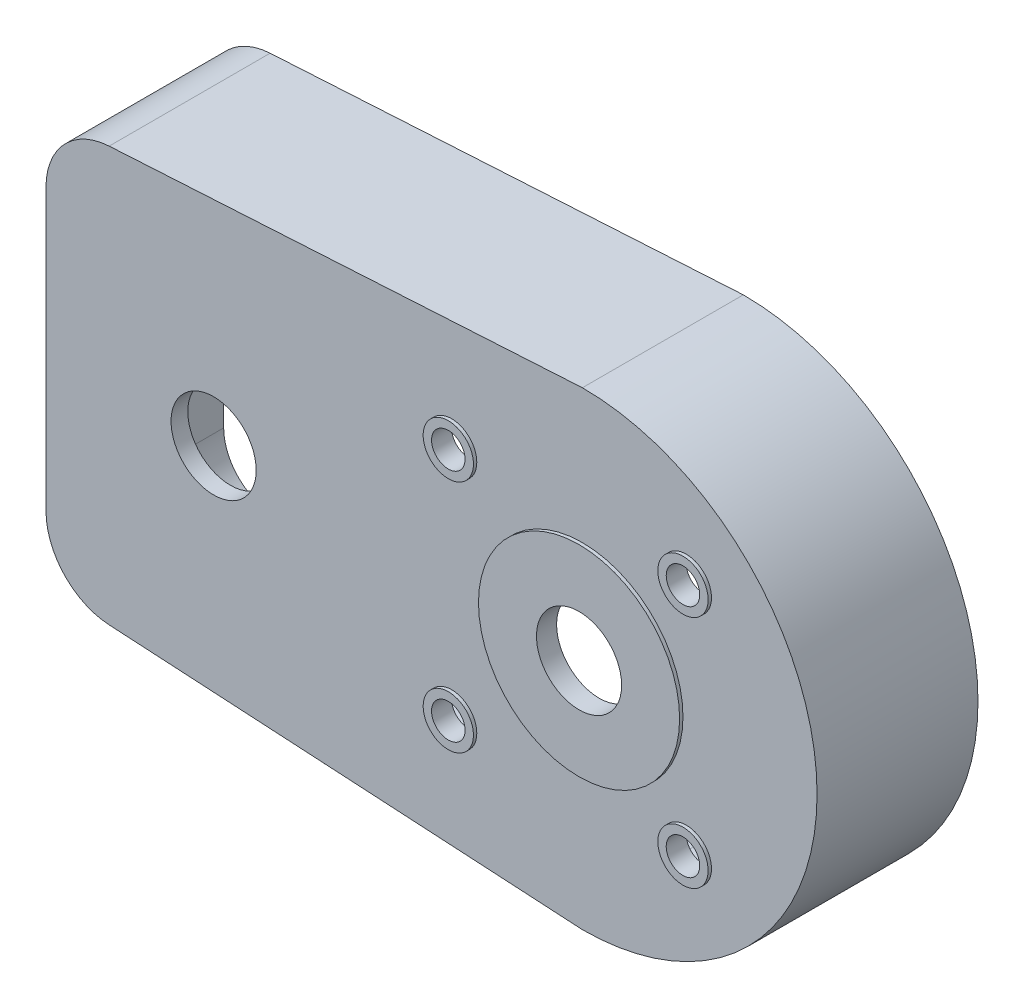
ISO-10303-21;
HEADER;
FILE_DESCRIPTION(('STEP AP214'),'2;1');
FILE_NAME('part.step','',(''),(''),'','','');
FILE_SCHEMA(('AUTOMOTIVE_DESIGN { 1 0 10303 214 1 1 1 1 }'));
ENDSEC;
DATA;
#1=APPLICATION_CONTEXT('core data for automotive mechanical design processes');
#2=APPLICATION_PROTOCOL_DEFINITION('international standard','automotive_design',2000,#1);
#3=PRODUCT_CONTEXT('',#1,'mechanical');
#4=PRODUCT('Part','Part','',(#3));
#5=PRODUCT_RELATED_PRODUCT_CATEGORY('part','',(#4));
#6=PRODUCT_DEFINITION_FORMATION('','',#4);
#7=PRODUCT_DEFINITION_CONTEXT('part definition',#1,'design');
#8=PRODUCT_DEFINITION('design','',#6,#7);
#9=PRODUCT_DEFINITION_SHAPE('','',#8);
#10=(LENGTH_UNIT() NAMED_UNIT(*) SI_UNIT(.MILLI.,.METRE.));
#11=(NAMED_UNIT(*) PLANE_ANGLE_UNIT() SI_UNIT($,.RADIAN.));
#12=(NAMED_UNIT(*) SI_UNIT($,.STERADIAN.) SOLID_ANGLE_UNIT());
#13=UNCERTAINTY_MEASURE_WITH_UNIT(LENGTH_MEASURE(1.E-05),#10,'distance_accuracy_value','');
#14=(GEOMETRIC_REPRESENTATION_CONTEXT(3) GLOBAL_UNCERTAINTY_ASSIGNED_CONTEXT((#13)) GLOBAL_UNIT_ASSIGNED_CONTEXT((#10,
#11,#12)) REPRESENTATION_CONTEXT('',''));
#15=CARTESIAN_POINT('',(0.,0.,0.));
#16=DIRECTION('',(0.,0.,1.));
#17=DIRECTION('',(1.,0.,0.));
#18=AXIS2_PLACEMENT_3D('',#15,#16,#17);
#19=CARTESIAN_POINT('',(160.,0.,-19.));
#20=DIRECTION('',(0.,0.,1.));
#21=DIRECTION('',(1.,0.,0.));
#22=AXIS2_PLACEMENT_3D('',#19,#20,#21);
#23=CYLINDRICAL_SURFACE('',#22,12.7);
#24=CARTESIAN_POINT('',(160.,0.,19.));
#25=DIRECTION('',(0.,0.,-1.));
#26=DIRECTION('',(-1.,0.,0.));
#27=AXIS2_PLACEMENT_3D('',#24,#25,#26);
#28=CIRCLE('',#27,12.7);
#29=CARTESIAN_POINT('',(147.3,0.,19.));
#30=VERTEX_POINT('',#29);
#31=EDGE_CURVE('E162',#30,#30,#28,.T.);
#32=ORIENTED_EDGE('',*,*,#31,.T.);
#33=EDGE_LOOP('',(#32));
#34=FACE_BOUND('',#33,.T.);
#35=CARTESIAN_POINT('',(160.,0.,25.));
#36=DIRECTION('',(0.,0.,1.));
#37=DIRECTION('',(1.,0.,0.));
#38=AXIS2_PLACEMENT_3D('',#35,#36,#37);
#39=CIRCLE('',#38,12.7);
#40=CARTESIAN_POINT('',(172.7,0.,25.));
#41=VERTEX_POINT('',#40);
#42=EDGE_CURVE('E45',#41,#41,#39,.T.);
#43=ORIENTED_EDGE('',*,*,#42,.T.);
#44=EDGE_LOOP('',(#43));
#45=FACE_BOUND('',#44,.T.);
#46=ADVANCED_FACE('F41',(#34,#45),#23,.F.);
#47=CARTESIAN_POINT('',(20.,41.8728550290396,24.));
#48=DIRECTION('',(0.,0.,1.));
#49=DIRECTION('',(1.,0.,0.));
#50=AXIS2_PLACEMENT_3D('',#47,#48,#49);
#51=PLANE('',#50);
#52=CARTESIAN_POINT('',(50.,0.,24.));
#53=DIRECTION('',(0.,0.,1.));
#54=DIRECTION('',(1.,0.,0.));
#55=AXIS2_PLACEMENT_3D('',#52,#53,#54);
#56=CIRCLE('',#55,12.7);
#57=CARTESIAN_POINT('',(62.7,0.,24.));
#58=VERTEX_POINT('',#57);
#59=EDGE_CURVE('E202',#58,#58,#56,.T.);
#60=ORIENTED_EDGE('',*,*,#59,.F.);
#61=EDGE_LOOP('',(#60));
#62=FACE_BOUND('',#61,.T.);
#63=CARTESIAN_POINT('',(160.,0.,24.));
#64=DIRECTION('',(0.,0.,1.));
#65=DIRECTION('',(1.,0.,0.));
#66=AXIS2_PLACEMENT_3D('',#63,#64,#65);
#67=CIRCLE('',#66,30.);
#68=CARTESIAN_POINT('',(190.,0.,24.));
#69=VERTEX_POINT('',#68);
#70=EDGE_CURVE('E196',#69,#69,#67,.F.);
#71=ORIENTED_EDGE('',*,*,#70,.T.);
#72=EDGE_LOOP('',(#71));
#73=FACE_BOUND('',#72,.T.);
#74=CARTESIAN_POINT('',(191.,35.,24.));
#75=DIRECTION('',(0.,0.,1.));
#76=DIRECTION('',(1.,0.,0.));
#77=AXIS2_PLACEMENT_3D('',#74,#75,#76);
#78=CIRCLE('',#77,7.50000000000001);
#79=CARTESIAN_POINT('',(198.5,35.,24.));
#80=VERTEX_POINT('',#79);
#81=EDGE_CURVE('E186',#80,#80,#78,.F.);
#82=ORIENTED_EDGE('',*,*,#81,.T.);
#83=EDGE_LOOP('',(#82));
#84=FACE_BOUND('',#83,.T.);
#85=CARTESIAN_POINT('',(121.,35.,24.));
#86=DIRECTION('',(0.,0.,1.));
#87=DIRECTION('',(1.,0.,0.));
#88=AXIS2_PLACEMENT_3D('',#85,#86,#87);
#89=CIRCLE('',#88,7.50000000000001);
#90=CARTESIAN_POINT('',(128.5,35.,24.));
#91=VERTEX_POINT('',#90);
#92=EDGE_CURVE('E170',#91,#91,#89,.F.);
#93=ORIENTED_EDGE('',*,*,#92,.T.);
#94=EDGE_LOOP('',(#93));
#95=FACE_BOUND('',#94,.T.);
#96=CARTESIAN_POINT('',(20.,41.8728550290396,24.));
#97=DIRECTION('',(0.,0.,1.));
#98=DIRECTION('',(1.,0.,0.));
#99=AXIS2_PLACEMENT_3D('',#96,#97,#98);
#100=CIRCLE('',#99,20.);
#101=CARTESIAN_POINT('',(18.8456774284378,61.8395157263316,24.));
#102=VERTEX_POINT('',#101);
#103=CARTESIAN_POINT('',(0.,41.8728550290396,24.));
#104=VERTEX_POINT('',#103);
#105=EDGE_CURVE('E157',#102,#104,#100,.T.);
#106=ORIENTED_EDGE('',*,*,#105,.T.);
#107=DIRECTION('',(0.,-1.,0.));
#108=VECTOR('',#107,1.);
#109=CARTESIAN_POINT('',(0.,41.8728550290396,24.));
#110=LINE('',#109,#108);
#111=CARTESIAN_POINT('',(0.,-41.8728550290396,24.));
#112=VERTEX_POINT('',#111);
#113=EDGE_CURVE('E100',#104,#112,#110,.T.);
#114=ORIENTED_EDGE('',*,*,#113,.T.);
#115=CARTESIAN_POINT('',(20.,-41.8728550290396,24.));
#116=DIRECTION('',(0.,0.,-1.));
#117=DIRECTION('',(-1.,0.,0.));
#118=AXIS2_PLACEMENT_3D('',#115,#116,#117);
#119=CIRCLE('',#118,20.);
#120=CARTESIAN_POINT('',(18.8456774284378,-61.8395157263316,24.));
#121=VERTEX_POINT('',#120);
#122=EDGE_CURVE('E122',#121,#112,#119,.T.);
#123=ORIENTED_EDGE('',*,*,#122,.F.);
#124=DIRECTION('',(0.998333034864596,-0.0577161285781096,0.));
#125=VECTOR('',#124,1.);
#126=CARTESIAN_POINT('',(18.8456774284378,-61.8395157263316,24.));
#127=LINE('',#126,#125);
#128=CARTESIAN_POINT('',(160.,-70.,24.));
#129=VERTEX_POINT('',#128);
#130=EDGE_CURVE('E113',#121,#129,#127,.T.);
#131=ORIENTED_EDGE('',*,*,#130,.T.);
#132=CARTESIAN_POINT('',(160.,0.,24.));
#133=DIRECTION('',(0.,0.,1.));
#134=DIRECTION('',(1.,0.,0.));
#135=AXIS2_PLACEMENT_3D('',#132,#133,#134);
#136=CIRCLE('',#135,70.);
#137=CARTESIAN_POINT('',(160.,70.,24.));
#138=VERTEX_POINT('',#137);
#139=EDGE_CURVE('E119',#129,#138,#136,.T.);
#140=ORIENTED_EDGE('',*,*,#139,.T.);
#141=DIRECTION('',(0.998333034864596,0.0577161285781096,0.));
#142=VECTOR('',#141,1.);
#143=CARTESIAN_POINT('',(18.8456774284378,61.8395157263316,24.));
#144=LINE('',#143,#142);
#145=EDGE_CURVE('E137',#102,#138,#144,.T.);
#146=ORIENTED_EDGE('',*,*,#145,.F.);
#147=EDGE_LOOP('',(#106,#114,#123,#131,#140,#146));
#148=FACE_BOUND('',#147,.T.);
#149=CARTESIAN_POINT('',(121.,-35.,24.));
#150=DIRECTION('',(0.,0.,1.));
#151=DIRECTION('',(1.,0.,0.));
#152=AXIS2_PLACEMENT_3D('',#149,#150,#151);
#153=CIRCLE('',#152,7.50000000000001);
#154=CARTESIAN_POINT('',(128.5,-35.,24.));
#155=VERTEX_POINT('',#154);
#156=EDGE_CURVE('E181',#155,#155,#153,.F.);
#157=ORIENTED_EDGE('',*,*,#156,.T.);
#158=EDGE_LOOP('',(#157));
#159=FACE_BOUND('',#158,.T.);
#160=CARTESIAN_POINT('',(191.,-35.,24.));
#161=DIRECTION('',(0.,0.,1.));
#162=DIRECTION('',(1.,0.,0.));
#163=AXIS2_PLACEMENT_3D('',#160,#161,#162);
#164=CIRCLE('',#163,7.50000000000001);
#165=CARTESIAN_POINT('',(198.5,-35.,24.));
#166=VERTEX_POINT('',#165);
#167=EDGE_CURVE('E191',#166,#166,#164,.F.);
#168=ORIENTED_EDGE('',*,*,#167,.T.);
#169=EDGE_LOOP('',(#168));
#170=FACE_BOUND('',#169,.T.);
#171=ADVANCED_FACE('F115',(#62,#73,#84,#95,#148,#159,#170),#51,.T.);
#172=CARTESIAN_POINT('',(20.,41.8728550290396,19.));
#173=DIRECTION('',(0.,0.,-1.));
#174=DIRECTION('',(-1.,0.,0.));
#175=AXIS2_PLACEMENT_3D('',#172,#173,#174);
#176=PLANE('',#175);
#177=CARTESIAN_POINT('',(50.,0.,19.));
#178=DIRECTION('',(0.,0.,-1.));
#179=DIRECTION('',(-1.,0.,0.));
#180=AXIS2_PLACEMENT_3D('',#177,#178,#179);
#181=CIRCLE('',#180,12.7);
#182=CARTESIAN_POINT('',(37.3,0.,19.));
#183=VERTEX_POINT('',#182);
#184=EDGE_CURVE('E200',#183,#183,#181,.T.);
#185=ORIENTED_EDGE('',*,*,#184,.F.);
#186=EDGE_LOOP('',(#185));
#187=FACE_BOUND('',#186,.T.);
#188=CARTESIAN_POINT('',(121.,-35.,19.));
#189=DIRECTION('',(0.,0.,-1.));
#190=DIRECTION('',(-1.,0.,0.));
#191=AXIS2_PLACEMENT_3D('',#188,#189,#190);
#192=CIRCLE('',#191,4.99999999999999);
#193=CARTESIAN_POINT('',(116.,-35.,19.));
#194=VERTEX_POINT('',#193);
#195=EDGE_CURVE('E165',#194,#194,#192,.F.);
#196=ORIENTED_EDGE('',*,*,#195,.T.);
#197=EDGE_LOOP('',(#196));
#198=FACE_BOUND('',#197,.T.);
#199=CARTESIAN_POINT('',(191.,-35.,19.));
#200=DIRECTION('',(0.,0.,-1.));
#201=DIRECTION('',(-1.,0.,0.));
#202=AXIS2_PLACEMENT_3D('',#199,#200,#201);
#203=CIRCLE('',#202,5.00000000000002);
#204=CARTESIAN_POINT('',(186.,-35.,19.));
#205=VERTEX_POINT('',#204);
#206=EDGE_CURVE('E166',#205,#205,#203,.F.);
#207=ORIENTED_EDGE('',*,*,#206,.T.);
#208=EDGE_LOOP('',(#207));
#209=FACE_BOUND('',#208,.T.);
#210=ORIENTED_EDGE('',*,*,#31,.F.);
#211=EDGE_LOOP('',(#210));
#212=FACE_BOUND('',#211,.T.);
#213=CARTESIAN_POINT('',(20.,41.8728550290396,19.));
#214=DIRECTION('',(0.,0.,-1.));
#215=DIRECTION('',(-1.,0.,0.));
#216=AXIS2_PLACEMENT_3D('',#213,#214,#215);
#217=CIRCLE('',#216,15.);
#218=CARTESIAN_POINT('',(5.,41.8728550290396,19.));
#219=VERTEX_POINT('',#218);
#220=CARTESIAN_POINT('',(19.1342580713284,56.8478505520086,19.));
#221=VERTEX_POINT('',#220);
#222=EDGE_CURVE('E229',#219,#221,#217,.T.);
#223=ORIENTED_EDGE('',*,*,#222,.T.);
#224=DIRECTION('',(0.998333034864596,0.0577161285781096,0.));
#225=VECTOR('',#224,1.);
#226=CARTESIAN_POINT('',(19.1342580713284,56.8478505520086,19.));
#227=LINE('',#226,#225);
#228=CARTESIAN_POINT('',(160.141737642964,64.9998454647438,19.));
#229=VERTEX_POINT('',#228);
#230=EDGE_CURVE('E232',#221,#229,#227,.T.);
#231=ORIENTED_EDGE('',*,*,#230,.T.);
#232=CARTESIAN_POINT('',(160.,0.,19.));
#233=DIRECTION('',(0.,0.,-1.));
#234=DIRECTION('',(-1.,0.,0.));
#235=AXIS2_PLACEMENT_3D('',#232,#233,#234);
#236=CIRCLE('',#235,65.);
#237=CARTESIAN_POINT('',(160.141737642964,-64.9998454647438,19.));
#238=VERTEX_POINT('',#237);
#239=EDGE_CURVE('E236',#229,#238,#236,.T.);
#240=ORIENTED_EDGE('',*,*,#239,.T.);
#241=DIRECTION('',(-0.998333034864596,0.0577161285781096,0.));
#242=VECTOR('',#241,1.);
#243=CARTESIAN_POINT('',(160.141737642964,-64.9998454647438,19.));
#244=LINE('',#243,#242);
#245=CARTESIAN_POINT('',(19.1342580713284,-56.8478505520086,19.));
#246=VERTEX_POINT('',#245);
#247=EDGE_CURVE('E239',#238,#246,#244,.T.);
#248=ORIENTED_EDGE('',*,*,#247,.T.);
#249=CARTESIAN_POINT('',(20.,-41.8728550290396,19.));
#250=DIRECTION('',(0.,0.,-1.));
#251=DIRECTION('',(-1.,0.,0.));
#252=AXIS2_PLACEMENT_3D('',#249,#250,#251);
#253=CIRCLE('',#252,15.);
#254=CARTESIAN_POINT('',(5.00000000000001,-41.8728550290396,19.));
#255=VERTEX_POINT('',#254);
#256=EDGE_CURVE('E242',#246,#255,#253,.T.);
#257=ORIENTED_EDGE('',*,*,#256,.T.);
#258=DIRECTION('',(0.,1.,0.));
#259=VECTOR('',#258,1.);
#260=CARTESIAN_POINT('',(5.00000000000001,-41.8728550290396,19.));
#261=LINE('',#260,#259);
#262=EDGE_CURVE('E245',#255,#219,#261,.T.);
#263=ORIENTED_EDGE('',*,*,#262,.T.);
#264=EDGE_LOOP('',(#223,#231,#240,#248,#257,#263));
#265=FACE_BOUND('',#264,.T.);
#266=CARTESIAN_POINT('',(191.,35.,19.));
#267=DIRECTION('',(0.,0.,-1.));
#268=DIRECTION('',(-1.,0.,0.));
#269=AXIS2_PLACEMENT_3D('',#266,#267,#268);
#270=CIRCLE('',#269,4.99999999999999);
#271=CARTESIAN_POINT('',(186.,35.,19.));
#272=VERTEX_POINT('',#271);
#273=EDGE_CURVE('E169',#272,#272,#270,.T.);
#274=ORIENTED_EDGE('',*,*,#273,.F.);
#275=EDGE_LOOP('',(#274));
#276=FACE_BOUND('',#275,.T.);
#277=CARTESIAN_POINT('',(121.,35.,19.));
#278=DIRECTION('',(0.,0.,-1.));
#279=DIRECTION('',(-1.,0.,0.));
#280=AXIS2_PLACEMENT_3D('',#277,#278,#279);
#281=CIRCLE('',#280,4.99999999999999);
#282=CARTESIAN_POINT('',(116.,35.,19.));
#283=VERTEX_POINT('',#282);
#284=EDGE_CURVE('E173',#283,#283,#281,.T.);
#285=ORIENTED_EDGE('',*,*,#284,.F.);
#286=EDGE_LOOP('',(#285));
#287=FACE_BOUND('',#286,.T.);
#288=ADVANCED_FACE('F293',(#187,#198,#209,#212,#265,#276,#287),#176,.T.);
#289=CARTESIAN_POINT('',(20.,41.8728550290396,24.));
#290=DIRECTION('',(0.,0.,-1.));
#291=DIRECTION('',(-1.,0.,0.));
#292=AXIS2_PLACEMENT_3D('',#289,#290,#291);
#293=CYLINDRICAL_SURFACE('',#292,20.);
#294=CARTESIAN_POINT('',(20.,41.8728550290396,-24.));
#295=DIRECTION('',(0.,0.,1.));
#296=DIRECTION('',(1.,0.,0.));
#297=AXIS2_PLACEMENT_3D('',#294,#295,#296);
#298=CIRCLE('',#297,20.);
#299=CARTESIAN_POINT('',(18.8456774284378,61.8395157263316,-24.));
#300=VERTEX_POINT('',#299);
#301=CARTESIAN_POINT('',(0.,41.8728550290396,-24.));
#302=VERTEX_POINT('',#301);
#303=EDGE_CURVE('E142',#300,#302,#298,.T.);
#304=ORIENTED_EDGE('',*,*,#303,.T.);
#305=DIRECTION('',(0.,0.,-1.));
#306=VECTOR('',#305,1.);
#307=CARTESIAN_POINT('',(0.,41.8728550290396,24.));
#308=LINE('',#307,#306);
#309=EDGE_CURVE('E11',#104,#302,#308,.T.);
#310=ORIENTED_EDGE('',*,*,#309,.F.);
#311=ORIENTED_EDGE('',*,*,#105,.F.);
#312=DIRECTION('',(0.,0.,-1.));
#313=VECTOR('',#312,1.);
#314=CARTESIAN_POINT('',(18.8456774284378,61.8395157263316,24.));
#315=LINE('',#314,#313);
#316=EDGE_CURVE('E67',#102,#300,#315,.T.);
#317=ORIENTED_EDGE('',*,*,#316,.T.);
#318=EDGE_LOOP('',(#304,#310,#311,#317));
#319=FACE_BOUND('',#318,.T.);
#320=ADVANCED_FACE('F43',(#319),#293,.T.);
#321=CARTESIAN_POINT('',(0.,41.8728550290396,24.));
#322=DIRECTION('',(1.,0.,0.));
#323=DIRECTION('',(0.,1.,0.));
#324=AXIS2_PLACEMENT_3D('',#321,#322,#323);
#325=PLANE('',#324);
#326=DIRECTION('',(0.,-1.,0.));
#327=VECTOR('',#326,1.);
#328=CARTESIAN_POINT('',(0.,41.8728550290396,-24.));
#329=LINE('',#328,#327);
#330=CARTESIAN_POINT('',(0.,-41.8728550290396,-24.));
#331=VERTEX_POINT('',#330);
#332=EDGE_CURVE('E144',#302,#331,#329,.T.);
#333=ORIENTED_EDGE('',*,*,#332,.T.);
#334=DIRECTION('',(0.,0.,-1.));
#335=VECTOR('',#334,1.);
#336=CARTESIAN_POINT('',(0.,-41.8728550290396,24.));
#337=LINE('',#336,#335);
#338=EDGE_CURVE('E50',#112,#331,#337,.T.);
#339=ORIENTED_EDGE('',*,*,#338,.F.);
#340=ORIENTED_EDGE('',*,*,#113,.F.);
#341=ORIENTED_EDGE('',*,*,#309,.T.);
#342=EDGE_LOOP('',(#333,#339,#340,#341));
#343=FACE_BOUND('',#342,.T.);
#344=ADVANCED_FACE('F286',(#343),#325,.F.);
#345=CARTESIAN_POINT('',(20.,-41.8728550290396,24.));
#346=DIRECTION('',(0.,0.,-1.));
#347=DIRECTION('',(-1.,0.,0.));
#348=AXIS2_PLACEMENT_3D('',#345,#346,#347);
#349=CYLINDRICAL_SURFACE('',#348,20.);
#350=CARTESIAN_POINT('',(20.,-41.8728550290396,-24.));
#351=DIRECTION('',(0.,0.,-1.));
#352=DIRECTION('',(-1.,0.,0.));
#353=AXIS2_PLACEMENT_3D('',#350,#351,#352);
#354=CIRCLE('',#353,20.);
#355=CARTESIAN_POINT('',(18.8456774284378,-61.8395157263316,-24.));
#356=VERTEX_POINT('',#355);
#357=EDGE_CURVE('E148',#356,#331,#354,.T.);
#358=ORIENTED_EDGE('',*,*,#357,.F.);
#359=DIRECTION('',(0.,0.,-1.));
#360=VECTOR('',#359,1.);
#361=CARTESIAN_POINT('',(18.8456774284378,-61.8395157263316,24.));
#362=LINE('',#361,#360);
#363=EDGE_CURVE('E133',#121,#356,#362,.T.);
#364=ORIENTED_EDGE('',*,*,#363,.F.);
#365=ORIENTED_EDGE('',*,*,#122,.T.);
#366=ORIENTED_EDGE('',*,*,#338,.T.);
#367=EDGE_LOOP('',(#358,#364,#365,#366));
#368=FACE_BOUND('',#367,.T.);
#369=ADVANCED_FACE('F281',(#368),#349,.T.);
#370=CARTESIAN_POINT('',(18.8456774284378,-61.8395157263316,24.));
#371=DIRECTION('',(0.0577161285781096,0.998333034864596,0.));
#372=DIRECTION('',(-0.998333034864596,0.0577161285781096,0.));
#373=AXIS2_PLACEMENT_3D('',#370,#371,#372);
#374=PLANE('',#373);
#375=DIRECTION('',(0.998333034864596,-0.0577161285781096,0.));
#376=VECTOR('',#375,1.);
#377=CARTESIAN_POINT('',(18.8456774284378,-61.8395157263316,-24.));
#378=LINE('',#377,#376);
#379=CARTESIAN_POINT('',(160.,-70.,-24.));
#380=VERTEX_POINT('',#379);
#381=EDGE_CURVE('E129',#356,#380,#378,.T.);
#382=ORIENTED_EDGE('',*,*,#381,.T.);
#383=DIRECTION('',(0.,0.,-1.));
#384=VECTOR('',#383,1.);
#385=CARTESIAN_POINT('',(160.,-70.,24.));
#386=LINE('',#385,#384);
#387=EDGE_CURVE('E126',#129,#380,#386,.T.);
#388=ORIENTED_EDGE('',*,*,#387,.F.);
#389=ORIENTED_EDGE('',*,*,#130,.F.);
#390=ORIENTED_EDGE('',*,*,#363,.T.);
#391=EDGE_LOOP('',(#382,#388,#389,#390));
#392=FACE_BOUND('',#391,.T.);
#393=ADVANCED_FACE('F127',(#392),#374,.F.);
#394=CARTESIAN_POINT('',(160.,0.,24.));
#395=DIRECTION('',(0.,0.,-1.));
#396=DIRECTION('',(-1.,0.,0.));
#397=AXIS2_PLACEMENT_3D('',#394,#395,#396);
#398=CYLINDRICAL_SURFACE('',#397,70.);
#399=CARTESIAN_POINT('',(160.,0.,-24.));
#400=DIRECTION('',(0.,0.,1.));
#401=DIRECTION('',(1.,0.,0.));
#402=AXIS2_PLACEMENT_3D('',#399,#400,#401);
#403=CIRCLE('',#402,70.);
#404=CARTESIAN_POINT('',(160.,70.,-24.));
#405=VERTEX_POINT('',#404);
#406=EDGE_CURVE('E152',#380,#405,#403,.T.);
#407=ORIENTED_EDGE('',*,*,#406,.T.);
#408=DIRECTION('',(0.,0.,-1.));
#409=VECTOR('',#408,1.);
#410=CARTESIAN_POINT('',(160.,70.,24.));
#411=LINE('',#410,#409);
#412=EDGE_CURVE('E134',#138,#405,#411,.T.);
#413=ORIENTED_EDGE('',*,*,#412,.F.);
#414=ORIENTED_EDGE('',*,*,#139,.F.);
#415=ORIENTED_EDGE('',*,*,#387,.T.);
#416=EDGE_LOOP('',(#407,#413,#414,#415));
#417=FACE_BOUND('',#416,.T.);
#418=ADVANCED_FACE('F136',(#417),#398,.T.);
#419=CARTESIAN_POINT('',(18.8456774284378,61.8395157263316,24.));
#420=DIRECTION('',(-0.0577161285781096,0.998333034864596,0.));
#421=DIRECTION('',(-0.998333034864596,-0.0577161285781096,0.));
#422=AXIS2_PLACEMENT_3D('',#419,#420,#421);
#423=PLANE('',#422);
#424=DIRECTION('',(0.998333034864596,0.0577161285781096,0.));
#425=VECTOR('',#424,1.);
#426=CARTESIAN_POINT('',(18.8456774284378,61.8395157263316,-24.));
#427=LINE('',#426,#425);
#428=EDGE_CURVE('E154',#300,#405,#427,.T.);
#429=ORIENTED_EDGE('',*,*,#428,.F.);
#430=ORIENTED_EDGE('',*,*,#316,.F.);
#431=ORIENTED_EDGE('',*,*,#145,.T.);
#432=ORIENTED_EDGE('',*,*,#412,.T.);
#433=EDGE_LOOP('',(#429,#430,#431,#432));
#434=FACE_BOUND('',#433,.T.);
#435=ADVANCED_FACE('F284',(#434),#423,.T.);
#436=CARTESIAN_POINT('',(20.,41.8728550290396,-24.));
#437=DIRECTION('',(0.,0.,1.));
#438=DIRECTION('',(1.,0.,0.));
#439=AXIS2_PLACEMENT_3D('',#436,#437,#438);
#440=PLANE('',#439);
#441=DIRECTION('',(0.998333034864596,0.0577161285781096,0.));
#442=VECTOR('',#441,1.);
#443=CARTESIAN_POINT('',(19.1342580713284,56.8478505520086,-24.));
#444=LINE('',#443,#442);
#445=CARTESIAN_POINT('',(19.1342580713284,56.8478505520086,-24.));
#446=VERTEX_POINT('',#445);
#447=CARTESIAN_POINT('',(160.141737642964,64.9998454647438,-24.));
#448=VERTEX_POINT('',#447);
#449=EDGE_CURVE('E250',#446,#448,#444,.T.);
#450=ORIENTED_EDGE('',*,*,#449,.F.);
#451=CARTESIAN_POINT('',(20.,41.8728550290396,-24.));
#452=DIRECTION('',(0.,0.,-1.));
#453=DIRECTION('',(-1.,0.,0.));
#454=AXIS2_PLACEMENT_3D('',#451,#452,#453);
#455=CIRCLE('',#454,15.);
#456=CARTESIAN_POINT('',(5.,41.8728550290396,-24.));
#457=VERTEX_POINT('',#456);
#458=EDGE_CURVE('E58',#457,#446,#455,.T.);
#459=ORIENTED_EDGE('',*,*,#458,.F.);
#460=DIRECTION('',(0.,1.,0.));
#461=VECTOR('',#460,1.);
#462=CARTESIAN_POINT('',(5.00000000000001,-41.8728550290396,-24.));
#463=LINE('',#462,#461);
#464=CARTESIAN_POINT('',(5.00000000000001,-41.8728550290396,-24.));
#465=VERTEX_POINT('',#464);
#466=EDGE_CURVE('E233',#465,#457,#463,.T.);
#467=ORIENTED_EDGE('',*,*,#466,.F.);
#468=CARTESIAN_POINT('',(20.,-41.8728550290396,-24.));
#469=DIRECTION('',(0.,0.,-1.));
#470=DIRECTION('',(-1.,0.,0.));
#471=AXIS2_PLACEMENT_3D('',#468,#469,#470);
#472=CIRCLE('',#471,15.);
#473=CARTESIAN_POINT('',(19.1342580713284,-56.8478505520086,-24.));
#474=VERTEX_POINT('',#473);
#475=EDGE_CURVE('E259',#474,#465,#472,.T.);
#476=ORIENTED_EDGE('',*,*,#475,.F.);
#477=DIRECTION('',(-0.998333034864596,0.0577161285781096,0.));
#478=VECTOR('',#477,1.);
#479=CARTESIAN_POINT('',(160.141737642964,-64.9998454647438,-24.));
#480=LINE('',#479,#478);
#481=CARTESIAN_POINT('',(160.141737642964,-64.9998454647438,-24.));
#482=VERTEX_POINT('',#481);
#483=EDGE_CURVE('E256',#482,#474,#480,.T.);
#484=ORIENTED_EDGE('',*,*,#483,.F.);
#485=CARTESIAN_POINT('',(160.,0.,-24.));
#486=DIRECTION('',(0.,0.,-1.));
#487=DIRECTION('',(-1.,0.,0.));
#488=AXIS2_PLACEMENT_3D('',#485,#486,#487);
#489=CIRCLE('',#488,65.);
#490=EDGE_CURVE('E253',#448,#482,#489,.T.);
#491=ORIENTED_EDGE('',*,*,#490,.F.);
#492=EDGE_LOOP('',(#450,#459,#467,#476,#484,#491));
#493=FACE_BOUND('',#492,.T.);
#494=ORIENTED_EDGE('',*,*,#303,.F.);
#495=ORIENTED_EDGE('',*,*,#428,.T.);
#496=ORIENTED_EDGE('',*,*,#406,.F.);
#497=ORIENTED_EDGE('',*,*,#381,.F.);
#498=ORIENTED_EDGE('',*,*,#357,.T.);
#499=ORIENTED_EDGE('',*,*,#332,.F.);
#500=EDGE_LOOP('',(#494,#495,#496,#497,#498,#499));
#501=FACE_BOUND('',#500,.T.);
#502=ADVANCED_FACE('F283',(#493,#501),#440,.F.);
#503=CARTESIAN_POINT('',(20.,41.8728550290396,19.));
#504=DIRECTION('',(0.,0.,-1.));
#505=DIRECTION('',(-1.,0.,0.));
#506=AXIS2_PLACEMENT_3D('',#503,#504,#505);
#507=CYLINDRICAL_SURFACE('',#506,15.);
#508=ORIENTED_EDGE('',*,*,#458,.T.);
#509=DIRECTION('',(0.,0.,-1.));
#510=VECTOR('',#509,1.);
#511=CARTESIAN_POINT('',(19.1342580713284,56.8478505520086,19.));
#512=LINE('',#511,#510);
#513=EDGE_CURVE('E248',#221,#446,#512,.T.);
#514=ORIENTED_EDGE('',*,*,#513,.F.);
#515=ORIENTED_EDGE('',*,*,#222,.F.);
#516=DIRECTION('',(0.,0.,-1.));
#517=VECTOR('',#516,1.);
#518=CARTESIAN_POINT('',(5.,41.8728550290396,19.));
#519=LINE('',#518,#517);
#520=EDGE_CURVE('E145',#219,#457,#519,.T.);
#521=ORIENTED_EDGE('',*,*,#520,.T.);
#522=EDGE_LOOP('',(#508,#514,#515,#521));
#523=FACE_BOUND('',#522,.T.);
#524=ADVANCED_FACE('F316',(#523),#507,.F.);
#525=CARTESIAN_POINT('',(5.00000000000001,-41.8728550290396,19.));
#526=DIRECTION('',(-1.,0.,0.));
#527=DIRECTION('',(0.,-1.,0.));
#528=AXIS2_PLACEMENT_3D('',#525,#526,#527);
#529=PLANE('',#528);
#530=ORIENTED_EDGE('',*,*,#466,.T.);
#531=ORIENTED_EDGE('',*,*,#520,.F.);
#532=ORIENTED_EDGE('',*,*,#262,.F.);
#533=DIRECTION('',(0.,0.,-1.));
#534=VECTOR('',#533,1.);
#535=CARTESIAN_POINT('',(5.00000000000001,-41.8728550290396,19.));
#536=LINE('',#535,#534);
#537=EDGE_CURVE('E265',#255,#465,#536,.T.);
#538=ORIENTED_EDGE('',*,*,#537,.T.);
#539=EDGE_LOOP('',(#530,#531,#532,#538));
#540=FACE_BOUND('',#539,.T.);
#541=ADVANCED_FACE('F312',(#540),#529,.F.);
#542=CARTESIAN_POINT('',(20.,-41.8728550290396,19.));
#543=DIRECTION('',(0.,0.,-1.));
#544=DIRECTION('',(-1.,0.,0.));
#545=AXIS2_PLACEMENT_3D('',#542,#543,#544);
#546=CYLINDRICAL_SURFACE('',#545,15.);
#547=ORIENTED_EDGE('',*,*,#475,.T.);
#548=ORIENTED_EDGE('',*,*,#537,.F.);
#549=ORIENTED_EDGE('',*,*,#256,.F.);
#550=DIRECTION('',(0.,0.,-1.));
#551=VECTOR('',#550,1.);
#552=CARTESIAN_POINT('',(19.1342580713284,-56.8478505520086,19.));
#553=LINE('',#552,#551);
#554=EDGE_CURVE('E268',#246,#474,#553,.T.);
#555=ORIENTED_EDGE('',*,*,#554,.T.);
#556=EDGE_LOOP('',(#547,#548,#549,#555));
#557=FACE_BOUND('',#556,.T.);
#558=ADVANCED_FACE('F315',(#557),#546,.F.);
#559=CARTESIAN_POINT('',(160.141737642964,-64.9998454647438,19.));
#560=DIRECTION('',(-0.0577161285781096,-0.998333034864596,0.));
#561=DIRECTION('',(0.998333034864596,-0.0577161285781096,0.));
#562=AXIS2_PLACEMENT_3D('',#559,#560,#561);
#563=PLANE('',#562);
#564=ORIENTED_EDGE('',*,*,#483,.T.);
#565=ORIENTED_EDGE('',*,*,#554,.F.);
#566=ORIENTED_EDGE('',*,*,#247,.F.);
#567=DIRECTION('',(0.,0.,-1.));
#568=VECTOR('',#567,1.);
#569=CARTESIAN_POINT('',(160.141737642964,-64.9998454647438,19.));
#570=LINE('',#569,#568);
#571=EDGE_CURVE('E271',#238,#482,#570,.T.);
#572=ORIENTED_EDGE('',*,*,#571,.T.);
#573=EDGE_LOOP('',(#564,#565,#566,#572));
#574=FACE_BOUND('',#573,.T.);
#575=ADVANCED_FACE('F320',(#574),#563,.F.);
#576=CARTESIAN_POINT('',(160.,0.,19.));
#577=DIRECTION('',(0.,0.,-1.));
#578=DIRECTION('',(-1.,0.,0.));
#579=AXIS2_PLACEMENT_3D('',#576,#577,#578);
#580=CYLINDRICAL_SURFACE('',#579,65.);
#581=ORIENTED_EDGE('',*,*,#490,.T.);
#582=ORIENTED_EDGE('',*,*,#571,.F.);
#583=ORIENTED_EDGE('',*,*,#239,.F.);
#584=DIRECTION('',(0.,0.,-1.));
#585=VECTOR('',#584,1.);
#586=CARTESIAN_POINT('',(160.141737642964,64.9998454647438,19.));
#587=LINE('',#586,#585);
#588=EDGE_CURVE('E274',#229,#448,#587,.T.);
#589=ORIENTED_EDGE('',*,*,#588,.T.);
#590=EDGE_LOOP('',(#581,#582,#583,#589));
#591=FACE_BOUND('',#590,.T.);
#592=ADVANCED_FACE('F324',(#591),#580,.F.);
#593=CARTESIAN_POINT('',(19.1342580713284,56.8478505520086,19.));
#594=DIRECTION('',(-0.0577161285781096,0.998333034864596,0.));
#595=DIRECTION('',(-0.998333034864596,-0.0577161285781096,0.));
#596=AXIS2_PLACEMENT_3D('',#593,#594,#595);
#597=PLANE('',#596);
#598=ORIENTED_EDGE('',*,*,#449,.T.);
#599=ORIENTED_EDGE('',*,*,#588,.F.);
#600=ORIENTED_EDGE('',*,*,#230,.F.);
#601=ORIENTED_EDGE('',*,*,#513,.T.);
#602=EDGE_LOOP('',(#598,#599,#600,#601));
#603=FACE_BOUND('',#602,.T.);
#604=ADVANCED_FACE('F328',(#603),#597,.F.);
#605=CARTESIAN_POINT('',(191.,-35.,-19.));
#606=DIRECTION('',(0.,0.,1.));
#607=DIRECTION('',(1.,0.,0.));
#608=AXIS2_PLACEMENT_3D('',#605,#606,#607);
#609=CYLINDRICAL_SURFACE('',#608,5.00000000000002);
#610=ORIENTED_EDGE('',*,*,#206,.F.);
#611=EDGE_LOOP('',(#610));
#612=FACE_BOUND('',#611,.T.);
#613=CARTESIAN_POINT('',(191.,-35.,25.));
#614=DIRECTION('',(0.,0.,1.));
#615=DIRECTION('',(1.,0.,0.));
#616=AXIS2_PLACEMENT_3D('',#613,#614,#615);
#617=CIRCLE('',#616,5.00000000000002);
#618=CARTESIAN_POINT('',(196.,-35.,25.));
#619=VERTEX_POINT('',#618);
#620=EDGE_CURVE('E195',#619,#619,#617,.T.);
#621=ORIENTED_EDGE('',*,*,#620,.T.);
#622=EDGE_LOOP('',(#621));
#623=FACE_BOUND('',#622,.T.);
#624=ADVANCED_FACE('F307',(#612,#623),#609,.F.);
#625=CARTESIAN_POINT('',(191.,35.,-19.));
#626=DIRECTION('',(0.,0.,1.));
#627=DIRECTION('',(1.,0.,0.));
#628=AXIS2_PLACEMENT_3D('',#625,#626,#627);
#629=CYLINDRICAL_SURFACE('',#628,4.99999999999999);
#630=ORIENTED_EDGE('',*,*,#273,.T.);
#631=EDGE_LOOP('',(#630));
#632=FACE_BOUND('',#631,.T.);
#633=CARTESIAN_POINT('',(191.,35.,25.));
#634=DIRECTION('',(0.,0.,1.));
#635=DIRECTION('',(-1.,0.,0.));
#636=AXIS2_PLACEMENT_3D('',#633,#634,#635);
#637=CIRCLE('',#636,5.00000000000002);
#638=CARTESIAN_POINT('',(186.,35.,25.));
#639=VERTEX_POINT('',#638);
#640=EDGE_CURVE('E190',#639,#639,#637,.T.);
#641=ORIENTED_EDGE('',*,*,#640,.T.);
#642=EDGE_LOOP('',(#641));
#643=FACE_BOUND('',#642,.T.);
#644=ADVANCED_FACE('F400',(#632,#643),#629,.F.);
#645=CARTESIAN_POINT('',(121.,35.,-19.));
#646=DIRECTION('',(0.,0.,1.));
#647=DIRECTION('',(1.,0.,0.));
#648=AXIS2_PLACEMENT_3D('',#645,#646,#647);
#649=CYLINDRICAL_SURFACE('',#648,4.99999999999999);
#650=ORIENTED_EDGE('',*,*,#284,.T.);
#651=EDGE_LOOP('',(#650));
#652=FACE_BOUND('',#651,.T.);
#653=CARTESIAN_POINT('',(121.,35.,25.));
#654=DIRECTION('',(0.,0.,1.));
#655=DIRECTION('',(1.,0.,0.));
#656=AXIS2_PLACEMENT_3D('',#653,#654,#655);
#657=CIRCLE('',#656,5.00000000000002);
#658=CARTESIAN_POINT('',(126.,35.,25.));
#659=VERTEX_POINT('',#658);
#660=EDGE_CURVE('E184',#659,#659,#657,.T.);
#661=ORIENTED_EDGE('',*,*,#660,.T.);
#662=EDGE_LOOP('',(#661));
#663=FACE_BOUND('',#662,.T.);
#664=ADVANCED_FACE('F409',(#652,#663),#649,.F.);
#665=CARTESIAN_POINT('',(121.,-35.,-19.));
#666=DIRECTION('',(0.,0.,1.));
#667=DIRECTION('',(1.,0.,0.));
#668=AXIS2_PLACEMENT_3D('',#665,#666,#667);
#669=CYLINDRICAL_SURFACE('',#668,4.99999999999999);
#670=ORIENTED_EDGE('',*,*,#195,.F.);
#671=EDGE_LOOP('',(#670));
#672=FACE_BOUND('',#671,.T.);
#673=CARTESIAN_POINT('',(121.,-35.,25.));
#674=DIRECTION('',(0.,0.,1.));
#675=DIRECTION('',(-1.,0.,0.));
#676=AXIS2_PLACEMENT_3D('',#673,#674,#675);
#677=CIRCLE('',#676,5.00000000000002);
#678=CARTESIAN_POINT('',(116.,-35.,25.));
#679=VERTEX_POINT('',#678);
#680=EDGE_CURVE('E185',#679,#679,#677,.T.);
#681=ORIENTED_EDGE('',*,*,#680,.T.);
#682=EDGE_LOOP('',(#681));
#683=FACE_BOUND('',#682,.T.);
#684=ADVANCED_FACE('F418',(#672,#683),#669,.F.);
#685=CARTESIAN_POINT('',(121.,35.,25.));
#686=DIRECTION('',(0.,0.,1.));
#687=DIRECTION('',(1.,0.,0.));
#688=AXIS2_PLACEMENT_3D('',#685,#686,#687);
#689=PLANE('',#688);
#690=CARTESIAN_POINT('',(121.,35.,25.));
#691=DIRECTION('',(0.,0.,1.));
#692=DIRECTION('',(1.,0.,0.));
#693=AXIS2_PLACEMENT_3D('',#690,#691,#692);
#694=CIRCLE('',#693,7.50000000000001);
#695=CARTESIAN_POINT('',(128.5,35.,25.));
#696=VERTEX_POINT('',#695);
#697=EDGE_CURVE('E180',#696,#696,#694,.T.);
#698=ORIENTED_EDGE('',*,*,#697,.T.);
#699=EDGE_LOOP('',(#698));
#700=FACE_BOUND('',#699,.T.);
#701=ORIENTED_EDGE('',*,*,#660,.F.);
#702=EDGE_LOOP('',(#701));
#703=FACE_BOUND('',#702,.T.);
#704=ADVANCED_FACE('F427',(#700,#703),#689,.T.);
#705=CARTESIAN_POINT('',(121.,35.,25.));
#706=DIRECTION('',(0.,0.,-1.));
#707=DIRECTION('',(-1.,0.,0.));
#708=AXIS2_PLACEMENT_3D('',#705,#706,#707);
#709=CYLINDRICAL_SURFACE('',#708,7.50000000000001);
#710=ORIENTED_EDGE('',*,*,#92,.F.);
#711=EDGE_LOOP('',(#710));
#712=FACE_BOUND('',#711,.T.);
#713=ORIENTED_EDGE('',*,*,#697,.F.);
#714=EDGE_LOOP('',(#713));
#715=FACE_BOUND('',#714,.T.);
#716=ADVANCED_FACE('F435',(#712,#715),#709,.T.);
#717=CARTESIAN_POINT('',(121.,-35.,25.));
#718=DIRECTION('',(0.,0.,-1.));
#719=DIRECTION('',(-1.,0.,0.));
#720=AXIS2_PLACEMENT_3D('',#717,#718,#719);
#721=PLANE('',#720);
#722=CARTESIAN_POINT('',(121.,-35.,25.));
#723=DIRECTION('',(0.,0.,1.));
#724=DIRECTION('',(-1.,0.,0.));
#725=AXIS2_PLACEMENT_3D('',#722,#723,#724);
#726=CIRCLE('',#725,7.50000000000001);
#727=CARTESIAN_POINT('',(113.5,-35.,25.));
#728=VERTEX_POINT('',#727);
#729=EDGE_CURVE('E189',#728,#728,#726,.T.);
#730=ORIENTED_EDGE('',*,*,#729,.T.);
#731=EDGE_LOOP('',(#730));
#732=FACE_BOUND('',#731,.T.);
#733=ORIENTED_EDGE('',*,*,#680,.F.);
#734=EDGE_LOOP('',(#733));
#735=FACE_BOUND('',#734,.T.);
#736=ADVANCED_FACE('F444',(#732,#735),#721,.F.);
#737=CARTESIAN_POINT('',(121.,-35.,25.));
#738=DIRECTION('',(0.,0.,-1.));
#739=DIRECTION('',(-1.,0.,0.));
#740=AXIS2_PLACEMENT_3D('',#737,#738,#739);
#741=CYLINDRICAL_SURFACE('',#740,7.50000000000001);
#742=ORIENTED_EDGE('',*,*,#156,.F.);
#743=EDGE_LOOP('',(#742));
#744=FACE_BOUND('',#743,.T.);
#745=ORIENTED_EDGE('',*,*,#729,.F.);
#746=EDGE_LOOP('',(#745));
#747=FACE_BOUND('',#746,.T.);
#748=ADVANCED_FACE('F453',(#744,#747),#741,.T.);
#749=CARTESIAN_POINT('',(191.,35.,25.));
#750=DIRECTION('',(0.,0.,-1.));
#751=DIRECTION('',(-1.,0.,0.));
#752=AXIS2_PLACEMENT_3D('',#749,#750,#751);
#753=PLANE('',#752);
#754=CARTESIAN_POINT('',(191.,35.,25.));
#755=DIRECTION('',(0.,0.,1.));
#756=DIRECTION('',(-1.,0.,0.));
#757=AXIS2_PLACEMENT_3D('',#754,#755,#756);
#758=CIRCLE('',#757,7.50000000000001);
#759=CARTESIAN_POINT('',(183.5,35.,25.));
#760=VERTEX_POINT('',#759);
#761=EDGE_CURVE('E194',#760,#760,#758,.T.);
#762=ORIENTED_EDGE('',*,*,#761,.T.);
#763=EDGE_LOOP('',(#762));
#764=FACE_BOUND('',#763,.T.);
#765=ORIENTED_EDGE('',*,*,#640,.F.);
#766=EDGE_LOOP('',(#765));
#767=FACE_BOUND('',#766,.T.);
#768=ADVANCED_FACE('F462',(#764,#767),#753,.F.);
#769=CARTESIAN_POINT('',(191.,35.,25.));
#770=DIRECTION('',(0.,0.,-1.));
#771=DIRECTION('',(-1.,0.,0.));
#772=AXIS2_PLACEMENT_3D('',#769,#770,#771);
#773=CYLINDRICAL_SURFACE('',#772,7.50000000000001);
#774=ORIENTED_EDGE('',*,*,#81,.F.);
#775=EDGE_LOOP('',(#774));
#776=FACE_BOUND('',#775,.T.);
#777=ORIENTED_EDGE('',*,*,#761,.F.);
#778=EDGE_LOOP('',(#777));
#779=FACE_BOUND('',#778,.T.);
#780=ADVANCED_FACE('F471',(#776,#779),#773,.T.);
#781=CARTESIAN_POINT('',(191.,-35.,25.));
#782=DIRECTION('',(0.,0.,1.));
#783=DIRECTION('',(1.,0.,0.));
#784=AXIS2_PLACEMENT_3D('',#781,#782,#783);
#785=PLANE('',#784);
#786=CARTESIAN_POINT('',(191.,-35.,25.));
#787=DIRECTION('',(0.,0.,1.));
#788=DIRECTION('',(1.,0.,0.));
#789=AXIS2_PLACEMENT_3D('',#786,#787,#788);
#790=CIRCLE('',#789,7.50000000000001);
#791=CARTESIAN_POINT('',(198.5,-35.,25.));
#792=VERTEX_POINT('',#791);
#793=EDGE_CURVE('E198',#792,#792,#790,.T.);
#794=ORIENTED_EDGE('',*,*,#793,.T.);
#795=EDGE_LOOP('',(#794));
#796=FACE_BOUND('',#795,.T.);
#797=ORIENTED_EDGE('',*,*,#620,.F.);
#798=EDGE_LOOP('',(#797));
#799=FACE_BOUND('',#798,.T.);
#800=ADVANCED_FACE('F480',(#796,#799),#785,.T.);
#801=CARTESIAN_POINT('',(191.,-35.,25.));
#802=DIRECTION('',(0.,0.,-1.));
#803=DIRECTION('',(-1.,0.,0.));
#804=AXIS2_PLACEMENT_3D('',#801,#802,#803);
#805=CYLINDRICAL_SURFACE('',#804,7.50000000000001);
#806=ORIENTED_EDGE('',*,*,#167,.F.);
#807=EDGE_LOOP('',(#806));
#808=FACE_BOUND('',#807,.T.);
#809=ORIENTED_EDGE('',*,*,#793,.F.);
#810=EDGE_LOOP('',(#809));
#811=FACE_BOUND('',#810,.T.);
#812=ADVANCED_FACE('F489',(#808,#811),#805,.T.);
#813=CARTESIAN_POINT('',(160.,0.,25.));
#814=DIRECTION('',(0.,0.,1.));
#815=DIRECTION('',(1.,0.,0.));
#816=AXIS2_PLACEMENT_3D('',#813,#814,#815);
#817=PLANE('',#816);
#818=ORIENTED_EDGE('',*,*,#42,.F.);
#819=EDGE_LOOP('',(#818));
#820=FACE_BOUND('',#819,.T.);
#821=CARTESIAN_POINT('',(160.,0.,25.));
#822=DIRECTION('',(0.,0.,1.));
#823=DIRECTION('',(1.,0.,0.));
#824=AXIS2_PLACEMENT_3D('',#821,#822,#823);
#825=CIRCLE('',#824,30.);
#826=CARTESIAN_POINT('',(190.,0.,25.));
#827=VERTEX_POINT('',#826);
#828=EDGE_CURVE('E199',#827,#827,#825,.T.);
#829=ORIENTED_EDGE('',*,*,#828,.T.);
#830=EDGE_LOOP('',(#829));
#831=FACE_BOUND('',#830,.T.);
#832=ADVANCED_FACE('F498',(#820,#831),#817,.T.);
#833=CARTESIAN_POINT('',(160.,0.,25.));
#834=DIRECTION('',(0.,0.,-1.));
#835=DIRECTION('',(-1.,0.,0.));
#836=AXIS2_PLACEMENT_3D('',#833,#834,#835);
#837=CYLINDRICAL_SURFACE('',#836,30.);
#838=ORIENTED_EDGE('',*,*,#70,.F.);
#839=EDGE_LOOP('',(#838));
#840=FACE_BOUND('',#839,.T.);
#841=ORIENTED_EDGE('',*,*,#828,.F.);
#842=EDGE_LOOP('',(#841));
#843=FACE_BOUND('',#842,.T.);
#844=ADVANCED_FACE('F505',(#840,#843),#837,.T.);
#845=CARTESIAN_POINT('',(50.,0.,14.));
#846=DIRECTION('',(0.,0.,1.));
#847=DIRECTION('',(1.,0.,0.));
#848=AXIS2_PLACEMENT_3D('',#845,#846,#847);
#849=CYLINDRICAL_SURFACE('',#848,12.7);
#850=ORIENTED_EDGE('',*,*,#184,.T.);
#851=EDGE_LOOP('',(#850));
#852=FACE_BOUND('',#851,.T.);
#853=ORIENTED_EDGE('',*,*,#59,.T.);
#854=EDGE_LOOP('',(#853));
#855=FACE_BOUND('',#854,.T.);
#856=ADVANCED_FACE('F508',(#852,#855),#849,.F.);
#857=CLOSED_SHELL('',(#46,#171,#288,#320,#344,#369,#393,#418,#435,#502,#524,#541,#558,#575,#592,
#604,#624,#644,#664,#684,#704,#716,#736,#748,#768,#780,#800,#812,#832,#844,#856));
#858=MANIFOLD_SOLID_BREP('B2',#857);
#859=ADVANCED_BREP_SHAPE_REPRESENTATION('',(#18,#858),#14);
#860=SHAPE_DEFINITION_REPRESENTATION(#9,#859);
ENDSEC;
END-ISO-10303-21;
